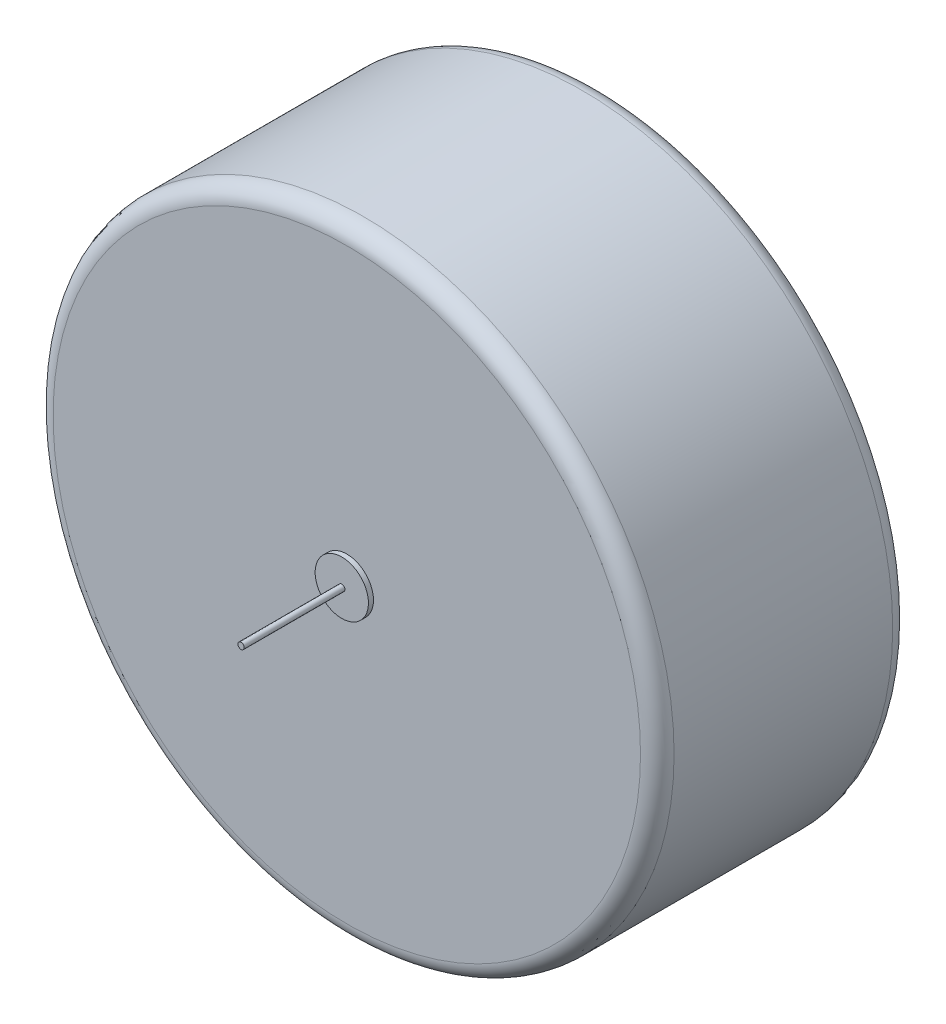
ISO-10303-21;
HEADER;
FILE_DESCRIPTION(('STEP AP214'),'2;1');
FILE_NAME('part.step','',(''),(''),'','','');
FILE_SCHEMA(('AUTOMOTIVE_DESIGN { 1 0 10303 214 1 1 1 1 }'));
ENDSEC;
DATA;
#1=APPLICATION_CONTEXT('core data for automotive mechanical design processes');
#2=APPLICATION_PROTOCOL_DEFINITION('international standard','automotive_design',2000,#1);
#3=PRODUCT_CONTEXT('',#1,'mechanical');
#4=PRODUCT('Part','Part','',(#3));
#5=PRODUCT_RELATED_PRODUCT_CATEGORY('part','',(#4));
#6=PRODUCT_DEFINITION_FORMATION('','',#4);
#7=PRODUCT_DEFINITION_CONTEXT('part definition',#1,'design');
#8=PRODUCT_DEFINITION('design','',#6,#7);
#9=PRODUCT_DEFINITION_SHAPE('','',#8);
#10=(LENGTH_UNIT() NAMED_UNIT(*) SI_UNIT(.MILLI.,.METRE.));
#11=(NAMED_UNIT(*) PLANE_ANGLE_UNIT() SI_UNIT($,.RADIAN.));
#12=(NAMED_UNIT(*) SI_UNIT($,.STERADIAN.) SOLID_ANGLE_UNIT());
#13=UNCERTAINTY_MEASURE_WITH_UNIT(LENGTH_MEASURE(1.E-05),#10,'distance_accuracy_value','');
#14=(GEOMETRIC_REPRESENTATION_CONTEXT(3) GLOBAL_UNCERTAINTY_ASSIGNED_CONTEXT((#13)) GLOBAL_UNIT_ASSIGNED_CONTEXT((#10,
#11,#12)) REPRESENTATION_CONTEXT('',''));
#15=CARTESIAN_POINT('',(0.,0.,0.));
#16=DIRECTION('',(0.,0.,1.));
#17=DIRECTION('',(1.,0.,0.));
#18=AXIS2_PLACEMENT_3D('',#15,#16,#17);
#19=CARTESIAN_POINT('',(0.,0.,-30.05));
#20=DIRECTION('',(0.,0.,1.));
#21=DIRECTION('',(1.,0.,0.));
#22=AXIS2_PLACEMENT_3D('',#19,#20,#21);
#23=CYLINDRICAL_SURFACE('',#22,37.);
#24=CARTESIAN_POINT('',(0.,0.,-28.05));
#25=DIRECTION('',(0.,0.,1.));
#26=DIRECTION('',(1.,0.,0.));
#27=AXIS2_PLACEMENT_3D('',#24,#25,#26);
#28=CIRCLE('',#27,37.);
#29=CARTESIAN_POINT('',(37.,0.,-28.05));
#30=VERTEX_POINT('',#29);
#31=EDGE_CURVE('E55',#30,#30,#28,.T.);
#32=ORIENTED_EDGE('',*,*,#31,.T.);
#33=EDGE_LOOP('',(#32));
#34=FACE_BOUND('',#33,.T.);
#35=CARTESIAN_POINT('',(0.,0.,-2.));
#36=DIRECTION('',(0.,0.,1.));
#37=DIRECTION('',(1.,0.,0.));
#38=AXIS2_PLACEMENT_3D('',#35,#36,#37);
#39=CIRCLE('',#38,37.);
#40=CARTESIAN_POINT('',(37.,0.,-2.));
#41=VERTEX_POINT('',#40);
#42=EDGE_CURVE('E60',#41,#41,#39,.F.);
#43=ORIENTED_EDGE('',*,*,#42,.T.);
#44=EDGE_LOOP('',(#43));
#45=FACE_BOUND('',#44,.T.);
#46=ADVANCED_FACE('F42',(#34,#45),#23,.T.);
#47=CARTESIAN_POINT('',(0.,0.,-30.05));
#48=DIRECTION('',(0.,0.,1.));
#49=DIRECTION('',(1.,0.,0.));
#50=AXIS2_PLACEMENT_3D('',#47,#48,#49);
#51=PLANE('',#50);
#52=CARTESIAN_POINT('',(0.,0.,-30.05));
#53=DIRECTION('',(0.,0.,1.));
#54=DIRECTION('',(1.,0.,0.));
#55=AXIS2_PLACEMENT_3D('',#52,#53,#54);
#56=CIRCLE('',#55,35.);
#57=CARTESIAN_POINT('',(35.,0.,-30.05));
#58=VERTEX_POINT('',#57);
#59=EDGE_CURVE('E50',#58,#58,#56,.F.);
#60=ORIENTED_EDGE('',*,*,#59,.T.);
#61=EDGE_LOOP('',(#60));
#62=FACE_BOUND('',#61,.T.);
#63=ADVANCED_FACE('F105',(#62),#51,.F.);
#64=CARTESIAN_POINT('',(0.,0.,0.));
#65=DIRECTION('',(0.,0.,1.));
#66=DIRECTION('',(1.,0.,0.));
#67=AXIS2_PLACEMENT_3D('',#64,#65,#66);
#68=PLANE('',#67);
#69=CARTESIAN_POINT('',(0.,0.,0.));
#70=DIRECTION('',(0.,0.,1.));
#71=DIRECTION('',(1.,0.,0.));
#72=AXIS2_PLACEMENT_3D('',#69,#70,#71);
#73=CIRCLE('',#72,35.);
#74=CARTESIAN_POINT('',(35.,0.,0.));
#75=VERTEX_POINT('',#74);
#76=EDGE_CURVE('E10',#75,#75,#73,.T.);
#77=ORIENTED_EDGE('',*,*,#76,.T.);
#78=EDGE_LOOP('',(#77));
#79=FACE_BOUND('',#78,.T.);
#80=CARTESIAN_POINT('',(0.,0.,0.));
#81=DIRECTION('',(0.,0.,1.));
#82=DIRECTION('',(1.,0.,0.));
#83=AXIS2_PLACEMENT_3D('',#80,#81,#82);
#84=CIRCLE('',#83,3.175);
#85=CARTESIAN_POINT('',(3.175,0.,0.));
#86=VERTEX_POINT('',#85);
#87=EDGE_CURVE('E67',#86,#86,#84,.T.);
#88=ORIENTED_EDGE('',*,*,#87,.F.);
#89=EDGE_LOOP('',(#88));
#90=FACE_BOUND('',#89,.T.);
#91=ADVANCED_FACE('F100',(#79,#90),#68,.T.);
#92=CARTESIAN_POINT('',(0.,0.,0.6));
#93=DIRECTION('',(0.,0.,-1.));
#94=DIRECTION('',(-1.,0.,0.));
#95=AXIS2_PLACEMENT_3D('',#92,#93,#94);
#96=CYLINDRICAL_SURFACE('',#95,3.175);
#97=CARTESIAN_POINT('',(0.,0.,0.6));
#98=DIRECTION('',(0.,0.,1.));
#99=DIRECTION('',(1.,0.,0.));
#100=AXIS2_PLACEMENT_3D('',#97,#98,#99);
#101=CIRCLE('',#100,3.175);
#102=CARTESIAN_POINT('',(3.175,0.,0.6));
#103=VERTEX_POINT('',#102);
#104=EDGE_CURVE('E66',#103,#103,#101,.T.);
#105=ORIENTED_EDGE('',*,*,#104,.F.);
#106=EDGE_LOOP('',(#105));
#107=FACE_BOUND('',#106,.T.);
#108=ORIENTED_EDGE('',*,*,#87,.T.);
#109=EDGE_LOOP('',(#108));
#110=FACE_BOUND('',#109,.T.);
#111=ADVANCED_FACE('F94',(#107,#110),#96,.T.);
#112=CARTESIAN_POINT('',(0.,0.,0.6));
#113=DIRECTION('',(0.,0.,1.));
#114=DIRECTION('',(1.,0.,0.));
#115=AXIS2_PLACEMENT_3D('',#112,#113,#114);
#116=PLANE('',#115);
#117=CARTESIAN_POINT('',(0.,0.,0.6));
#118=DIRECTION('',(0.,0.,1.));
#119=DIRECTION('',(1.,0.,0.));
#120=AXIS2_PLACEMENT_3D('',#117,#118,#119);
#121=CIRCLE('',#120,0.375);
#122=CARTESIAN_POINT('',(0.375,0.,0.6));
#123=VERTEX_POINT('',#122);
#124=EDGE_CURVE('E75',#123,#123,#121,.T.);
#125=ORIENTED_EDGE('',*,*,#124,.F.);
#126=EDGE_LOOP('',(#125));
#127=FACE_BOUND('',#126,.T.);
#128=ORIENTED_EDGE('',*,*,#104,.T.);
#129=EDGE_LOOP('',(#128));
#130=FACE_BOUND('',#129,.T.);
#131=ADVANCED_FACE('F88',(#127,#130),#116,.T.);
#132=CARTESIAN_POINT('',(0.,0.,12.6));
#133=DIRECTION('',(0.,0.,-1.));
#134=DIRECTION('',(-1.,0.,0.));
#135=AXIS2_PLACEMENT_3D('',#132,#133,#134);
#136=CYLINDRICAL_SURFACE('',#135,0.375);
#137=CARTESIAN_POINT('',(0.,0.,12.6));
#138=DIRECTION('',(0.,0.,1.));
#139=DIRECTION('',(1.,0.,0.));
#140=AXIS2_PLACEMENT_3D('',#137,#138,#139);
#141=CIRCLE('',#140,0.375);
#142=CARTESIAN_POINT('',(0.375,0.,12.6));
#143=VERTEX_POINT('',#142);
#144=EDGE_CURVE('E71',#143,#143,#141,.T.);
#145=ORIENTED_EDGE('',*,*,#144,.F.);
#146=EDGE_LOOP('',(#145));
#147=FACE_BOUND('',#146,.T.);
#148=ORIENTED_EDGE('',*,*,#124,.T.);
#149=EDGE_LOOP('',(#148));
#150=FACE_BOUND('',#149,.T.);
#151=ADVANCED_FACE('F85',(#147,#150),#136,.T.);
#152=CARTESIAN_POINT('',(0.,0.,12.6));
#153=DIRECTION('',(0.,0.,1.));
#154=DIRECTION('',(1.,0.,0.));
#155=AXIS2_PLACEMENT_3D('',#152,#153,#154);
#156=PLANE('',#155);
#157=ORIENTED_EDGE('',*,*,#144,.T.);
#158=EDGE_LOOP('',(#157));
#159=FACE_BOUND('',#158,.T.);
#160=ADVANCED_FACE('F83',(#159),#156,.T.);
#161=CARTESIAN_POINT('',(0.,0.,-28.05));
#162=DIRECTION('',(0.,0.,1.));
#163=DIRECTION('',(1.,0.,0.));
#164=AXIS2_PLACEMENT_3D('',#161,#162,#163);
#165=TOROIDAL_SURFACE('',#164,35.,2.);
#166=ORIENTED_EDGE('',*,*,#59,.F.);
#167=EDGE_LOOP('',(#166));
#168=FACE_BOUND('',#167,.T.);
#169=ORIENTED_EDGE('',*,*,#31,.F.);
#170=EDGE_LOOP('',(#169));
#171=FACE_BOUND('',#170,.T.);
#172=ADVANCED_FACE('F117',(#168,#171),#165,.T.);
#173=CARTESIAN_POINT('',(0.,0.,-2.));
#174=DIRECTION('',(0.,0.,1.));
#175=DIRECTION('',(1.,0.,0.));
#176=AXIS2_PLACEMENT_3D('',#173,#174,#175);
#177=TOROIDAL_SURFACE('',#176,35.,2.);
#178=ORIENTED_EDGE('',*,*,#42,.F.);
#179=EDGE_LOOP('',(#178));
#180=FACE_BOUND('',#179,.T.);
#181=ORIENTED_EDGE('',*,*,#76,.F.);
#182=EDGE_LOOP('',(#181));
#183=FACE_BOUND('',#182,.T.);
#184=ADVANCED_FACE('F44',(#180,#183),#177,.T.);
#185=CLOSED_SHELL('',(#46,#63,#91,#111,#131,#151,#160,#172,#184));
#186=MANIFOLD_SOLID_BREP('B2',#185);
#187=ADVANCED_BREP_SHAPE_REPRESENTATION('',(#18,#186),#14);
#188=SHAPE_DEFINITION_REPRESENTATION(#9,#187);
ENDSEC;
END-ISO-10303-21;
